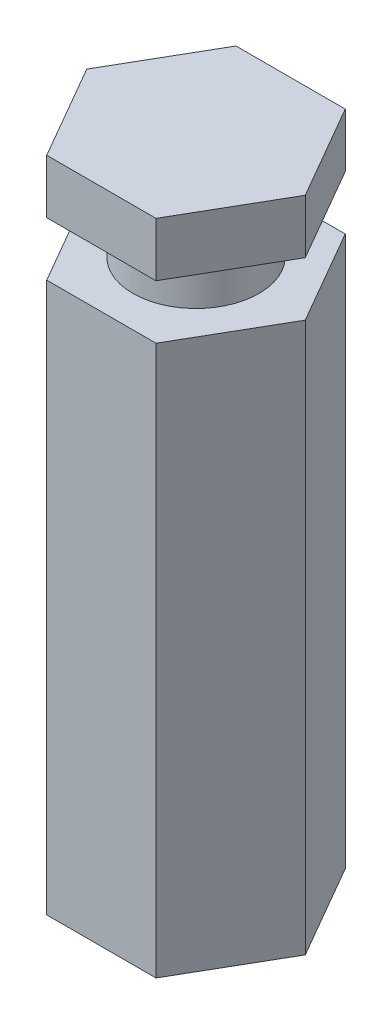
ISO-10303-21;
HEADER;
FILE_DESCRIPTION(('STEP AP214'),'2;1');
FILE_NAME('part.step','',(''),(''),'','','');
FILE_SCHEMA(('AUTOMOTIVE_DESIGN { 1 0 10303 214 1 1 1 1 }'));
ENDSEC;
DATA;
#1=APPLICATION_CONTEXT('core data for automotive mechanical design processes');
#2=APPLICATION_PROTOCOL_DEFINITION('international standard','automotive_design',2000,#1);
#3=PRODUCT_CONTEXT('',#1,'mechanical');
#4=PRODUCT('Part','Part','',(#3));
#5=PRODUCT_RELATED_PRODUCT_CATEGORY('part','',(#4));
#6=PRODUCT_DEFINITION_FORMATION('','',#4);
#7=PRODUCT_DEFINITION_CONTEXT('part definition',#1,'design');
#8=PRODUCT_DEFINITION('design','',#6,#7);
#9=PRODUCT_DEFINITION_SHAPE('','',#8);
#10=(LENGTH_UNIT() NAMED_UNIT(*) SI_UNIT(.MILLI.,.METRE.));
#11=(NAMED_UNIT(*) PLANE_ANGLE_UNIT() SI_UNIT($,.RADIAN.));
#12=(NAMED_UNIT(*) SI_UNIT($,.STERADIAN.) SOLID_ANGLE_UNIT());
#13=UNCERTAINTY_MEASURE_WITH_UNIT(LENGTH_MEASURE(1.E-05),#10,'distance_accuracy_value','');
#14=(GEOMETRIC_REPRESENTATION_CONTEXT(3) GLOBAL_UNCERTAINTY_ASSIGNED_CONTEXT((#13)) GLOBAL_UNIT_ASSIGNED_CONTEXT((#10,
#11,#12)) REPRESENTATION_CONTEXT('',''));
#15=CARTESIAN_POINT('',(0.,0.,0.));
#16=DIRECTION('',(0.,0.,1.));
#17=DIRECTION('',(1.,0.,0.));
#18=AXIS2_PLACEMENT_3D('',#15,#16,#17);
#19=CARTESIAN_POINT('',(6.06217782649114,61.,10.5));
#20=DIRECTION('',(-0.866025403784442,0.,-0.499999999999994));
#21=DIRECTION('',(-0.499999999999994,0.,0.866025403784442));
#22=AXIS2_PLACEMENT_3D('',#19,#20,#21);
#23=PLANE('',#22);
#24=DIRECTION('',(0.499999999999994,0.,-0.866025403784442));
#25=VECTOR('',#24,1.);
#26=CARTESIAN_POINT('',(6.06217782649114,0.,10.5));
#27=LINE('',#26,#25);
#28=CARTESIAN_POINT('',(6.06217782649114,0.,10.5));
#29=VERTEX_POINT('',#28);
#30=CARTESIAN_POINT('',(12.1243556529821,0.,0.));
#31=VERTEX_POINT('',#30);
#32=EDGE_CURVE('E138',#29,#31,#27,.T.);
#33=ORIENTED_EDGE('',*,*,#32,.T.);
#34=DIRECTION('',(0.,-1.,0.));
#35=VECTOR('',#34,1.);
#36=CARTESIAN_POINT('',(12.1243556529821,61.,0.));
#37=LINE('',#36,#35);
#38=CARTESIAN_POINT('',(12.1243556529821,61.,0.));
#39=VERTEX_POINT('',#38);
#40=EDGE_CURVE('E46',#39,#31,#37,.T.);
#41=ORIENTED_EDGE('',*,*,#40,.F.);
#42=DIRECTION('',(0.499999999999994,0.,-0.866025403784442));
#43=VECTOR('',#42,1.);
#44=CARTESIAN_POINT('',(6.06217782649114,61.,10.5));
#45=LINE('',#44,#43);
#46=CARTESIAN_POINT('',(6.06217782649114,61.,10.5));
#47=VERTEX_POINT('',#46);
#48=EDGE_CURVE('E155',#47,#39,#45,.T.);
#49=ORIENTED_EDGE('',*,*,#48,.F.);
#50=DIRECTION('',(0.,-1.,0.));
#51=VECTOR('',#50,1.);
#52=CARTESIAN_POINT('',(6.06217782649114,61.,10.5));
#53=LINE('',#52,#51);
#54=EDGE_CURVE('E134',#47,#29,#53,.T.);
#55=ORIENTED_EDGE('',*,*,#54,.T.);
#56=EDGE_LOOP('',(#33,#41,#49,#55));
#57=FACE_BOUND('',#56,.T.);
#58=ADVANCED_FACE('F43',(#57),#23,.F.);
#59=CARTESIAN_POINT('',(12.1243556529821,61.,0.));
#60=DIRECTION('',(-0.866025403784435,0.,0.500000000000006));
#61=DIRECTION('',(0.500000000000006,0.,0.866025403784435));
#62=AXIS2_PLACEMENT_3D('',#59,#60,#61);
#63=PLANE('',#62);
#64=DIRECTION('',(-0.500000000000006,0.,-0.866025403784435));
#65=VECTOR('',#64,1.);
#66=CARTESIAN_POINT('',(12.1243556529821,0.,0.));
#67=LINE('',#66,#65);
#68=CARTESIAN_POINT('',(6.06217782649099,0.,-10.5));
#69=VERTEX_POINT('',#68);
#70=EDGE_CURVE('E142',#31,#69,#67,.T.);
#71=ORIENTED_EDGE('',*,*,#70,.T.);
#72=DIRECTION('',(0.,-1.,0.));
#73=VECTOR('',#72,1.);
#74=CARTESIAN_POINT('',(6.06217782649099,61.,-10.5));
#75=LINE('',#74,#73);
#76=CARTESIAN_POINT('',(6.06217782649099,61.,-10.5));
#77=VERTEX_POINT('',#76);
#78=EDGE_CURVE('E161',#77,#69,#75,.T.);
#79=ORIENTED_EDGE('',*,*,#78,.F.);
#80=DIRECTION('',(-0.500000000000006,0.,-0.866025403784435));
#81=VECTOR('',#80,1.);
#82=CARTESIAN_POINT('',(12.1243556529821,61.,0.));
#83=LINE('',#82,#81);
#84=EDGE_CURVE('E100',#39,#77,#83,.T.);
#85=ORIENTED_EDGE('',*,*,#84,.F.);
#86=ORIENTED_EDGE('',*,*,#40,.T.);
#87=EDGE_LOOP('',(#71,#79,#85,#86));
#88=FACE_BOUND('',#87,.T.);
#89=ADVANCED_FACE('F168',(#88),#63,.F.);
#90=CARTESIAN_POINT('',(6.06217782649099,61.,-10.5));
#91=DIRECTION('',(0.,0.,1.));
#92=DIRECTION('',(1.,0.,0.));
#93=AXIS2_PLACEMENT_3D('',#90,#91,#92);
#94=PLANE('',#93);
#95=DIRECTION('',(-1.,0.,0.));
#96=VECTOR('',#95,1.);
#97=CARTESIAN_POINT('',(6.06217782649099,0.,-10.5));
#98=LINE('',#97,#96);
#99=CARTESIAN_POINT('',(-6.06217782649114,0.,-10.5));
#100=VERTEX_POINT('',#99);
#101=EDGE_CURVE('E146',#69,#100,#98,.T.);
#102=ORIENTED_EDGE('',*,*,#101,.T.);
#103=DIRECTION('',(0.,-1.,0.));
#104=VECTOR('',#103,1.);
#105=CARTESIAN_POINT('',(-6.06217782649114,61.,-10.5));
#106=LINE('',#105,#104);
#107=CARTESIAN_POINT('',(-6.06217782649114,61.,-10.5));
#108=VERTEX_POINT('',#107);
#109=EDGE_CURVE('E127',#108,#100,#106,.T.);
#110=ORIENTED_EDGE('',*,*,#109,.F.);
#111=DIRECTION('',(-1.,0.,0.));
#112=VECTOR('',#111,1.);
#113=CARTESIAN_POINT('',(6.06217782649099,61.,-10.5));
#114=LINE('',#113,#112);
#115=EDGE_CURVE('E116',#77,#108,#114,.T.);
#116=ORIENTED_EDGE('',*,*,#115,.F.);
#117=ORIENTED_EDGE('',*,*,#78,.T.);
#118=EDGE_LOOP('',(#102,#110,#116,#117));
#119=FACE_BOUND('',#118,.T.);
#120=ADVANCED_FACE('F174',(#119),#94,.F.);
#121=CARTESIAN_POINT('',(-6.06217782649114,61.,-10.5));
#122=DIRECTION('',(0.866025403784442,0.,0.499999999999994));
#123=DIRECTION('',(0.499999999999994,0.,-0.866025403784442));
#124=AXIS2_PLACEMENT_3D('',#121,#122,#123);
#125=PLANE('',#124);
#126=DIRECTION('',(-0.499999999999994,0.,0.866025403784442));
#127=VECTOR('',#126,1.);
#128=CARTESIAN_POINT('',(-6.06217782649114,0.,-10.5));
#129=LINE('',#128,#127);
#130=CARTESIAN_POINT('',(-12.1243556529821,0.,0.));
#131=VERTEX_POINT('',#130);
#132=EDGE_CURVE('E125',#100,#131,#129,.T.);
#133=ORIENTED_EDGE('',*,*,#132,.T.);
#134=DIRECTION('',(0.,-1.,0.));
#135=VECTOR('',#134,1.);
#136=CARTESIAN_POINT('',(-12.1243556529821,61.,0.));
#137=LINE('',#136,#135);
#138=CARTESIAN_POINT('',(-12.1243556529821,61.,0.));
#139=VERTEX_POINT('',#138);
#140=EDGE_CURVE('E122',#139,#131,#137,.T.);
#141=ORIENTED_EDGE('',*,*,#140,.F.);
#142=DIRECTION('',(-0.499999999999994,0.,0.866025403784442));
#143=VECTOR('',#142,1.);
#144=CARTESIAN_POINT('',(-6.06217782649114,61.,-10.5));
#145=LINE('',#144,#143);
#146=EDGE_CURVE('E110',#108,#139,#145,.T.);
#147=ORIENTED_EDGE('',*,*,#146,.F.);
#148=ORIENTED_EDGE('',*,*,#109,.T.);
#149=EDGE_LOOP('',(#133,#141,#147,#148));
#150=FACE_BOUND('',#149,.T.);
#151=ADVANCED_FACE('F123',(#150),#125,.F.);
#152=CARTESIAN_POINT('',(-12.1243556529821,61.,0.));
#153=DIRECTION('',(0.866025403784435,0.,-0.500000000000006));
#154=DIRECTION('',(-0.500000000000006,0.,-0.866025403784435));
#155=AXIS2_PLACEMENT_3D('',#152,#153,#154);
#156=PLANE('',#155);
#157=DIRECTION('',(0.500000000000006,0.,0.866025403784435));
#158=VECTOR('',#157,1.);
#159=CARTESIAN_POINT('',(-12.1243556529821,0.,0.));
#160=LINE('',#159,#158);
#161=CARTESIAN_POINT('',(-6.062177826491,0.,10.5));
#162=VERTEX_POINT('',#161);
#163=EDGE_CURVE('E85',#131,#162,#160,.T.);
#164=ORIENTED_EDGE('',*,*,#163,.T.);
#165=DIRECTION('',(0.,-1.,0.));
#166=VECTOR('',#165,1.);
#167=CARTESIAN_POINT('',(-6.062177826491,61.,10.5));
#168=LINE('',#167,#166);
#169=CARTESIAN_POINT('',(-6.062177826491,61.,10.5));
#170=VERTEX_POINT('',#169);
#171=EDGE_CURVE('E128',#170,#162,#168,.T.);
#172=ORIENTED_EDGE('',*,*,#171,.F.);
#173=DIRECTION('',(0.500000000000006,0.,0.866025403784435));
#174=VECTOR('',#173,1.);
#175=CARTESIAN_POINT('',(-12.1243556529821,61.,0.));
#176=LINE('',#175,#174);
#177=EDGE_CURVE('E114',#139,#170,#176,.T.);
#178=ORIENTED_EDGE('',*,*,#177,.F.);
#179=ORIENTED_EDGE('',*,*,#140,.T.);
#180=EDGE_LOOP('',(#164,#172,#178,#179));
#181=FACE_BOUND('',#180,.T.);
#182=ADVANCED_FACE('F130',(#181),#156,.F.);
#183=CARTESIAN_POINT('',(-6.062177826491,61.,10.5));
#184=DIRECTION('',(0.,0.,-1.));
#185=DIRECTION('',(-1.,0.,0.));
#186=AXIS2_PLACEMENT_3D('',#183,#184,#185);
#187=PLANE('',#186);
#188=DIRECTION('',(1.,0.,0.));
#189=VECTOR('',#188,1.);
#190=CARTESIAN_POINT('',(-6.062177826491,0.,10.5));
#191=LINE('',#190,#189);
#192=EDGE_CURVE('E91',#162,#29,#191,.T.);
#193=ORIENTED_EDGE('',*,*,#192,.T.);
#194=ORIENTED_EDGE('',*,*,#54,.F.);
#195=DIRECTION('',(1.,0.,0.));
#196=VECTOR('',#195,1.);
#197=CARTESIAN_POINT('',(-6.062177826491,61.,10.5));
#198=LINE('',#197,#196);
#199=EDGE_CURVE('E61',#170,#47,#198,.T.);
#200=ORIENTED_EDGE('',*,*,#199,.F.);
#201=ORIENTED_EDGE('',*,*,#171,.T.);
#202=EDGE_LOOP('',(#193,#194,#200,#201));
#203=FACE_BOUND('',#202,.T.);
#204=ADVANCED_FACE('F313',(#203),#187,.F.);
#205=CARTESIAN_POINT('',(0.,61.,0.));
#206=DIRECTION('',(0.,1.,0.));
#207=DIRECTION('',(0.,0.,1.));
#208=AXIS2_PLACEMENT_3D('',#205,#206,#207);
#209=PLANE('',#208);
#210=CARTESIAN_POINT('',(0.,61.,0.));
#211=DIRECTION('',(0.,1.,0.));
#212=DIRECTION('',(0.,0.,1.));
#213=AXIS2_PLACEMENT_3D('',#210,#211,#212);
#214=CIRCLE('',#213,7.);
#215=CARTESIAN_POINT('',(0.,61.,7.));
#216=VERTEX_POINT('',#215);
#217=EDGE_CURVE('E11',#216,#216,#214,.T.);
#218=ORIENTED_EDGE('',*,*,#217,.F.);
#219=EDGE_LOOP('',(#218));
#220=FACE_BOUND('',#219,.T.);
#221=ORIENTED_EDGE('',*,*,#48,.T.);
#222=ORIENTED_EDGE('',*,*,#84,.T.);
#223=ORIENTED_EDGE('',*,*,#115,.T.);
#224=ORIENTED_EDGE('',*,*,#146,.T.);
#225=ORIENTED_EDGE('',*,*,#177,.T.);
#226=ORIENTED_EDGE('',*,*,#199,.T.);
#227=EDGE_LOOP('',(#221,#222,#223,#224,#225,#226));
#228=FACE_BOUND('',#227,.T.);
#229=ADVANCED_FACE('F112',(#220,#228),#209,.T.);
#230=CARTESIAN_POINT('',(0.,0.,0.));
#231=DIRECTION('',(0.,1.,0.));
#232=DIRECTION('',(0.,0.,1.));
#233=AXIS2_PLACEMENT_3D('',#230,#231,#232);
#234=PLANE('',#233);
#235=ORIENTED_EDGE('',*,*,#32,.F.);
#236=ORIENTED_EDGE('',*,*,#192,.F.);
#237=ORIENTED_EDGE('',*,*,#163,.F.);
#238=ORIENTED_EDGE('',*,*,#132,.F.);
#239=ORIENTED_EDGE('',*,*,#101,.F.);
#240=ORIENTED_EDGE('',*,*,#70,.F.);
#241=EDGE_LOOP('',(#235,#236,#237,#238,#239,#240));
#242=FACE_BOUND('',#241,.T.);
#243=ADVANCED_FACE('F173',(#242),#234,.F.);
#244=CARTESIAN_POINT('',(0.,67.,0.));
#245=DIRECTION('',(0.,-1.,0.));
#246=DIRECTION('',(0.,0.,-1.));
#247=AXIS2_PLACEMENT_3D('',#244,#245,#246);
#248=CYLINDRICAL_SURFACE('',#247,7.);
#249=CARTESIAN_POINT('',(0.,67.,0.));
#250=DIRECTION('',(0.,1.,0.));
#251=DIRECTION('',(0.,0.,1.));
#252=AXIS2_PLACEMENT_3D('',#249,#250,#251);
#253=CIRCLE('',#252,7.);
#254=CARTESIAN_POINT('',(0.,67.,7.));
#255=VERTEX_POINT('',#254);
#256=EDGE_CURVE('E143',#255,#255,#253,.T.);
#257=ORIENTED_EDGE('',*,*,#256,.F.);
#258=EDGE_LOOP('',(#257));
#259=FACE_BOUND('',#258,.T.);
#260=ORIENTED_EDGE('',*,*,#217,.T.);
#261=EDGE_LOOP('',(#260));
#262=FACE_BOUND('',#261,.T.);
#263=ADVANCED_FACE('F318',(#259,#262),#248,.T.);
#264=CARTESIAN_POINT('',(6.06217782649107,73.,10.5));
#265=DIRECTION('',(-0.866025403784439,0.,-0.5));
#266=DIRECTION('',(-0.5,0.,0.866025403784439));
#267=AXIS2_PLACEMENT_3D('',#264,#265,#266);
#268=PLANE('',#267);
#269=DIRECTION('',(0.5,0.,-0.866025403784439));
#270=VECTOR('',#269,1.);
#271=CARTESIAN_POINT('',(6.06217782649107,67.,10.5));
#272=LINE('',#271,#270);
#273=CARTESIAN_POINT('',(6.06217782649107,67.,10.5));
#274=VERTEX_POINT('',#273);
#275=CARTESIAN_POINT('',(12.1243556529821,67.,0.));
#276=VERTEX_POINT('',#275);
#277=EDGE_CURVE('E230',#274,#276,#272,.T.);
#278=ORIENTED_EDGE('',*,*,#277,.T.);
#279=DIRECTION('',(0.,-1.,0.));
#280=VECTOR('',#279,1.);
#281=CARTESIAN_POINT('',(12.1243556529821,73.,0.));
#282=LINE('',#281,#280);
#283=CARTESIAN_POINT('',(12.1243556529821,73.,0.));
#284=VERTEX_POINT('',#283);
#285=EDGE_CURVE('E184',#284,#276,#282,.T.);
#286=ORIENTED_EDGE('',*,*,#285,.F.);
#287=DIRECTION('',(0.5,0.,-0.866025403784439));
#288=VECTOR('',#287,1.);
#289=CARTESIAN_POINT('',(6.06217782649107,73.,10.5));
#290=LINE('',#289,#288);
#291=CARTESIAN_POINT('',(6.06217782649107,73.,10.5));
#292=VERTEX_POINT('',#291);
#293=EDGE_CURVE('E213',#292,#284,#290,.T.);
#294=ORIENTED_EDGE('',*,*,#293,.F.);
#295=DIRECTION('',(0.,-1.,0.));
#296=VECTOR('',#295,1.);
#297=CARTESIAN_POINT('',(6.06217782649107,73.,10.5));
#298=LINE('',#297,#296);
#299=EDGE_CURVE('E204',#292,#274,#298,.T.);
#300=ORIENTED_EDGE('',*,*,#299,.T.);
#301=EDGE_LOOP('',(#278,#286,#294,#300));
#302=FACE_BOUND('',#301,.T.);
#303=ADVANCED_FACE('F267',(#302),#268,.F.);
#304=CARTESIAN_POINT('',(12.1243556529821,73.,0.));
#305=DIRECTION('',(-0.866025403784439,0.,0.5));
#306=DIRECTION('',(0.5,0.,0.866025403784439));
#307=AXIS2_PLACEMENT_3D('',#304,#305,#306);
#308=PLANE('',#307);
#309=DIRECTION('',(-0.5,0.,-0.866025403784439));
#310=VECTOR('',#309,1.);
#311=CARTESIAN_POINT('',(12.1243556529821,67.,0.));
#312=LINE('',#311,#310);
#313=CARTESIAN_POINT('',(6.06217782649107,67.,-10.5));
#314=VERTEX_POINT('',#313);
#315=EDGE_CURVE('E226',#276,#314,#312,.T.);
#316=ORIENTED_EDGE('',*,*,#315,.T.);
#317=DIRECTION('',(0.,-1.,0.));
#318=VECTOR('',#317,1.);
#319=CARTESIAN_POINT('',(6.06217782649107,73.,-10.5));
#320=LINE('',#319,#318);
#321=CARTESIAN_POINT('',(6.06217782649107,73.,-10.5));
#322=VERTEX_POINT('',#321);
#323=EDGE_CURVE('E188',#322,#314,#320,.T.);
#324=ORIENTED_EDGE('',*,*,#323,.F.);
#325=DIRECTION('',(-0.5,0.,-0.866025403784439));
#326=VECTOR('',#325,1.);
#327=CARTESIAN_POINT('',(12.1243556529821,73.,0.));
#328=LINE('',#327,#326);
#329=EDGE_CURVE('E249',#284,#322,#328,.T.);
#330=ORIENTED_EDGE('',*,*,#329,.F.);
#331=ORIENTED_EDGE('',*,*,#285,.T.);
#332=EDGE_LOOP('',(#316,#324,#330,#331));
#333=FACE_BOUND('',#332,.T.);
#334=ADVANCED_FACE('F271',(#333),#308,.F.);
#335=CARTESIAN_POINT('',(6.06217782649107,73.,-10.5));
#336=DIRECTION('',(0.,0.,1.));
#337=DIRECTION('',(1.,0.,0.));
#338=AXIS2_PLACEMENT_3D('',#335,#336,#337);
#339=PLANE('',#338);
#340=DIRECTION('',(-1.,0.,0.));
#341=VECTOR('',#340,1.);
#342=CARTESIAN_POINT('',(6.06217782649107,67.,-10.5));
#343=LINE('',#342,#341);
#344=CARTESIAN_POINT('',(-6.06217782649107,67.,-10.5));
#345=VERTEX_POINT('',#344);
#346=EDGE_CURVE('E222',#314,#345,#343,.T.);
#347=ORIENTED_EDGE('',*,*,#346,.T.);
#348=DIRECTION('',(0.,-1.,0.));
#349=VECTOR('',#348,1.);
#350=CARTESIAN_POINT('',(-6.06217782649107,73.,-10.5));
#351=LINE('',#350,#349);
#352=CARTESIAN_POINT('',(-6.06217782649107,73.,-10.5));
#353=VERTEX_POINT('',#352);
#354=EDGE_CURVE('E192',#353,#345,#351,.T.);
#355=ORIENTED_EDGE('',*,*,#354,.F.);
#356=DIRECTION('',(-1.,0.,0.));
#357=VECTOR('',#356,1.);
#358=CARTESIAN_POINT('',(6.06217782649107,73.,-10.5));
#359=LINE('',#358,#357);
#360=EDGE_CURVE('E245',#322,#353,#359,.T.);
#361=ORIENTED_EDGE('',*,*,#360,.F.);
#362=ORIENTED_EDGE('',*,*,#323,.T.);
#363=EDGE_LOOP('',(#347,#355,#361,#362));
#364=FACE_BOUND('',#363,.T.);
#365=ADVANCED_FACE('F329',(#364),#339,.F.);
#366=CARTESIAN_POINT('',(-6.06217782649107,73.,-10.5));
#367=DIRECTION('',(0.866025403784439,0.,0.5));
#368=DIRECTION('',(0.5,0.,-0.866025403784439));
#369=AXIS2_PLACEMENT_3D('',#366,#367,#368);
#370=PLANE('',#369);
#371=DIRECTION('',(-0.5,0.,0.866025403784439));
#372=VECTOR('',#371,1.);
#373=CARTESIAN_POINT('',(-6.06217782649107,67.,-10.5));
#374=LINE('',#373,#372);
#375=CARTESIAN_POINT('',(-12.1243556529821,67.,0.));
#376=VERTEX_POINT('',#375);
#377=EDGE_CURVE('E218',#345,#376,#374,.T.);
#378=ORIENTED_EDGE('',*,*,#377,.T.);
#379=DIRECTION('',(0.,-1.,0.));
#380=VECTOR('',#379,1.);
#381=CARTESIAN_POINT('',(-12.1243556529821,73.,0.));
#382=LINE('',#381,#380);
#383=CARTESIAN_POINT('',(-12.1243556529821,73.,0.));
#384=VERTEX_POINT('',#383);
#385=EDGE_CURVE('E196',#384,#376,#382,.T.);
#386=ORIENTED_EDGE('',*,*,#385,.F.);
#387=DIRECTION('',(-0.5,0.,0.866025403784439));
#388=VECTOR('',#387,1.);
#389=CARTESIAN_POINT('',(-6.06217782649107,73.,-10.5));
#390=LINE('',#389,#388);
#391=EDGE_CURVE('E241',#353,#384,#390,.T.);
#392=ORIENTED_EDGE('',*,*,#391,.F.);
#393=ORIENTED_EDGE('',*,*,#354,.T.);
#394=EDGE_LOOP('',(#378,#386,#392,#393));
#395=FACE_BOUND('',#394,.T.);
#396=ADVANCED_FACE('F332',(#395),#370,.F.);
#397=CARTESIAN_POINT('',(-12.1243556529821,73.,0.));
#398=DIRECTION('',(0.866025403784439,0.,-0.5));
#399=DIRECTION('',(-0.5,0.,-0.866025403784439));
#400=AXIS2_PLACEMENT_3D('',#397,#398,#399);
#401=PLANE('',#400);
#402=DIRECTION('',(0.5,0.,0.866025403784439));
#403=VECTOR('',#402,1.);
#404=CARTESIAN_POINT('',(-12.1243556529821,67.,0.));
#405=LINE('',#404,#403);
#406=CARTESIAN_POINT('',(-6.06217782649107,67.,10.5));
#407=VERTEX_POINT('',#406);
#408=EDGE_CURVE('E214',#376,#407,#405,.T.);
#409=ORIENTED_EDGE('',*,*,#408,.T.);
#410=DIRECTION('',(0.,-1.,0.));
#411=VECTOR('',#410,1.);
#412=CARTESIAN_POINT('',(-6.06217782649107,73.,10.5));
#413=LINE('',#412,#411);
#414=CARTESIAN_POINT('',(-6.06217782649107,73.,10.5));
#415=VERTEX_POINT('',#414);
#416=EDGE_CURVE('E200',#415,#407,#413,.T.);
#417=ORIENTED_EDGE('',*,*,#416,.F.);
#418=DIRECTION('',(0.5,0.,0.866025403784439));
#419=VECTOR('',#418,1.);
#420=CARTESIAN_POINT('',(-12.1243556529821,73.,0.));
#421=LINE('',#420,#419);
#422=EDGE_CURVE('E237',#384,#415,#421,.T.);
#423=ORIENTED_EDGE('',*,*,#422,.F.);
#424=ORIENTED_EDGE('',*,*,#385,.T.);
#425=EDGE_LOOP('',(#409,#417,#423,#424));
#426=FACE_BOUND('',#425,.T.);
#427=ADVANCED_FACE('F336',(#426),#401,.F.);
#428=CARTESIAN_POINT('',(-6.06217782649107,73.,10.5));
#429=DIRECTION('',(0.,0.,-1.));
#430=DIRECTION('',(-1.,0.,0.));
#431=AXIS2_PLACEMENT_3D('',#428,#429,#430);
#432=PLANE('',#431);
#433=DIRECTION('',(1.,0.,0.));
#434=VECTOR('',#433,1.);
#435=CARTESIAN_POINT('',(-6.06217782649107,67.,10.5));
#436=LINE('',#435,#434);
#437=EDGE_CURVE('E209',#407,#274,#436,.T.);
#438=ORIENTED_EDGE('',*,*,#437,.T.);
#439=ORIENTED_EDGE('',*,*,#299,.F.);
#440=DIRECTION('',(1.,0.,0.));
#441=VECTOR('',#440,1.);
#442=CARTESIAN_POINT('',(-6.06217782649107,73.,10.5));
#443=LINE('',#442,#441);
#444=EDGE_CURVE('E208',#415,#292,#443,.T.);
#445=ORIENTED_EDGE('',*,*,#444,.F.);
#446=ORIENTED_EDGE('',*,*,#416,.T.);
#447=EDGE_LOOP('',(#438,#439,#445,#446));
#448=FACE_BOUND('',#447,.T.);
#449=ADVANCED_FACE('F290',(#448),#432,.F.);
#450=CARTESIAN_POINT('',(0.,73.,0.));
#451=DIRECTION('',(0.,1.,0.));
#452=DIRECTION('',(0.,0.,1.));
#453=AXIS2_PLACEMENT_3D('',#450,#451,#452);
#454=PLANE('',#453);
#455=ORIENTED_EDGE('',*,*,#293,.T.);
#456=ORIENTED_EDGE('',*,*,#329,.T.);
#457=ORIENTED_EDGE('',*,*,#360,.T.);
#458=ORIENTED_EDGE('',*,*,#391,.T.);
#459=ORIENTED_EDGE('',*,*,#422,.T.);
#460=ORIENTED_EDGE('',*,*,#444,.T.);
#461=EDGE_LOOP('',(#455,#456,#457,#458,#459,#460));
#462=FACE_BOUND('',#461,.T.);
#463=ADVANCED_FACE('F259',(#462),#454,.T.);
#464=CARTESIAN_POINT('',(0.,67.,0.));
#465=DIRECTION('',(0.,1.,0.));
#466=DIRECTION('',(0.,0.,1.));
#467=AXIS2_PLACEMENT_3D('',#464,#465,#466);
#468=PLANE('',#467);
#469=ORIENTED_EDGE('',*,*,#256,.T.);
#470=EDGE_LOOP('',(#469));
#471=FACE_BOUND('',#470,.T.);
#472=ORIENTED_EDGE('',*,*,#277,.F.);
#473=ORIENTED_EDGE('',*,*,#437,.F.);
#474=ORIENTED_EDGE('',*,*,#408,.F.);
#475=ORIENTED_EDGE('',*,*,#377,.F.);
#476=ORIENTED_EDGE('',*,*,#346,.F.);
#477=ORIENTED_EDGE('',*,*,#315,.F.);
#478=EDGE_LOOP('',(#472,#473,#474,#475,#476,#477));
#479=FACE_BOUND('',#478,.T.);
#480=ADVANCED_FACE('F291',(#471,#479),#468,.F.);
#481=CLOSED_SHELL('',(#58,#89,#120,#151,#182,#204,#229,#243,#263,#303,#334,#365,#396,#427,#449,
#463,#480));
#482=MANIFOLD_SOLID_BREP('B2',#481);
#483=ADVANCED_BREP_SHAPE_REPRESENTATION('',(#18,#482),#14);
#484=SHAPE_DEFINITION_REPRESENTATION(#9,#483);
ENDSEC;
END-ISO-10303-21;
